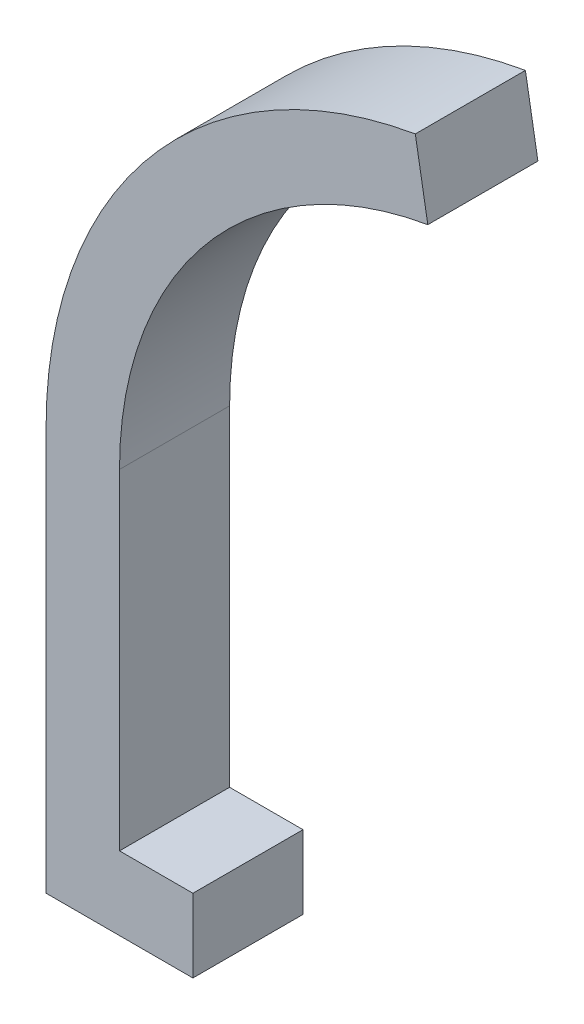
ISO-10303-21;
HEADER;
FILE_DESCRIPTION(('STEP AP214'),'2;1');
FILE_NAME('part.step','',(''),(''),'','','');
FILE_SCHEMA(('AUTOMOTIVE_DESIGN { 1 0 10303 214 1 1 1 1 }'));
ENDSEC;
DATA;
#1=APPLICATION_CONTEXT('core data for automotive mechanical design processes');
#2=APPLICATION_PROTOCOL_DEFINITION('international standard','automotive_design',2000,#1);
#3=PRODUCT_CONTEXT('',#1,'mechanical');
#4=PRODUCT('Part','Part','',(#3));
#5=PRODUCT_RELATED_PRODUCT_CATEGORY('part','',(#4));
#6=PRODUCT_DEFINITION_FORMATION('','',#4);
#7=PRODUCT_DEFINITION_CONTEXT('part definition',#1,'design');
#8=PRODUCT_DEFINITION('design','',#6,#7);
#9=PRODUCT_DEFINITION_SHAPE('','',#8);
#10=(LENGTH_UNIT() NAMED_UNIT(*) SI_UNIT(.MILLI.,.METRE.));
#11=(NAMED_UNIT(*) PLANE_ANGLE_UNIT() SI_UNIT($,.RADIAN.));
#12=(NAMED_UNIT(*) SI_UNIT($,.STERADIAN.) SOLID_ANGLE_UNIT());
#13=UNCERTAINTY_MEASURE_WITH_UNIT(LENGTH_MEASURE(1.E-05),#10,'distance_accuracy_value','');
#14=(GEOMETRIC_REPRESENTATION_CONTEXT(3) GLOBAL_UNCERTAINTY_ASSIGNED_CONTEXT((#13)) GLOBAL_UNIT_ASSIGNED_CONTEXT((#10,
#11,#12)) REPRESENTATION_CONTEXT('',''));
#15=CARTESIAN_POINT('',(0.,0.,0.));
#16=DIRECTION('',(0.,0.,1.));
#17=DIRECTION('',(1.,0.,0.));
#18=AXIS2_PLACEMENT_3D('',#15,#16,#17);
#19=CARTESIAN_POINT('',(-8.76923076923071,70.,30.));
#20=DIRECTION('',(0.,0.,-1.));
#21=DIRECTION('',(-1.,0.,0.));
#22=AXIS2_PLACEMENT_3D('',#19,#20,#21);
#23=CYLINDRICAL_SURFACE('',#22,101.230769230769);
#24=CARTESIAN_POINT('',(-8.76923076923071,70.,0.));
#25=DIRECTION('',(0.,0.,-1.));
#26=DIRECTION('',(-1.,0.,0.));
#27=AXIS2_PLACEMENT_3D('',#24,#25,#26);
#28=CIRCLE('',#27,101.230769230769);
#29=CARTESIAN_POINT('',(-110.,70.,0.));
#30=VERTEX_POINT('',#29);
#31=CARTESIAN_POINT('',(-26.,169.75354244722,0.));
#32=VERTEX_POINT('',#31);
#33=EDGE_CURVE('E132',#30,#32,#28,.T.);
#34=ORIENTED_EDGE('',*,*,#33,.T.);
#35=DIRECTION('',(0.,0.,-1.));
#36=VECTOR('',#35,1.);
#37=CARTESIAN_POINT('',(-26.,169.75354244722,30.));
#38=LINE('',#37,#36);
#39=CARTESIAN_POINT('',(-26.,169.75354244722,30.));
#40=VERTEX_POINT('',#39);
#41=EDGE_CURVE('E40',#40,#32,#38,.T.);
#42=ORIENTED_EDGE('',*,*,#41,.F.);
#43=CARTESIAN_POINT('',(-8.76923076923071,70.,30.));
#44=DIRECTION('',(0.,0.,-1.));
#45=DIRECTION('',(-1.,0.,0.));
#46=AXIS2_PLACEMENT_3D('',#43,#44,#45);
#47=CIRCLE('',#46,101.230769230769);
#48=CARTESIAN_POINT('',(-110.,70.,30.));
#49=VERTEX_POINT('',#48);
#50=EDGE_CURVE('E92',#49,#40,#47,.T.);
#51=ORIENTED_EDGE('',*,*,#50,.F.);
#52=DIRECTION('',(0.,0.,-1.));
#53=VECTOR('',#52,1.);
#54=CARTESIAN_POINT('',(-110.,70.,30.));
#55=LINE('',#54,#53);
#56=EDGE_CURVE('E11',#49,#30,#55,.T.);
#57=ORIENTED_EDGE('',*,*,#56,.T.);
#58=EDGE_LOOP('',(#34,#42,#51,#57));
#59=FACE_BOUND('',#58,.T.);
#60=ADVANCED_FACE('F32',(#59),#23,.F.);
#61=CARTESIAN_POINT('',(-26.,169.75354244722,30.));
#62=DIRECTION('',(-0.985407334205056,-0.170212765957447,0.));
#63=DIRECTION('',(0.170212765957447,-0.985407334205056,0.));
#64=AXIS2_PLACEMENT_3D('',#61,#62,#63);
#65=PLANE('',#64);
#66=DIRECTION('',(-0.170212765957447,0.985407334205056,0.));
#67=VECTOR('',#66,1.);
#68=CARTESIAN_POINT('',(-26.,169.75354244722,0.));
#69=LINE('',#68,#67);
#70=CARTESIAN_POINT('',(-29.404255319149,189.461689131321,0.));
#71=VERTEX_POINT('',#70);
#72=EDGE_CURVE('E134',#32,#71,#69,.T.);
#73=ORIENTED_EDGE('',*,*,#72,.T.);
#74=DIRECTION('',(0.,0.,-1.));
#75=VECTOR('',#74,1.);
#76=CARTESIAN_POINT('',(-29.404255319149,189.461689131321,30.));
#77=LINE('',#76,#75);
#78=CARTESIAN_POINT('',(-29.404255319149,189.461689131321,30.));
#79=VERTEX_POINT('',#78);
#80=EDGE_CURVE('E152',#79,#71,#77,.T.);
#81=ORIENTED_EDGE('',*,*,#80,.F.);
#82=DIRECTION('',(-0.170212765957447,0.985407334205056,0.));
#83=VECTOR('',#82,1.);
#84=CARTESIAN_POINT('',(-26.,169.75354244722,30.));
#85=LINE('',#84,#83);
#86=EDGE_CURVE('E160',#40,#79,#85,.T.);
#87=ORIENTED_EDGE('',*,*,#86,.F.);
#88=ORIENTED_EDGE('',*,*,#41,.T.);
#89=EDGE_LOOP('',(#73,#81,#87,#88));
#90=FACE_BOUND('',#89,.T.);
#91=ADVANCED_FACE('F158',(#90),#65,.F.);
#92=CARTESIAN_POINT('',(-8.76923076923071,70.,30.));
#93=DIRECTION('',(0.,0.,-1.));
#94=DIRECTION('',(-1.,0.,0.));
#95=AXIS2_PLACEMENT_3D('',#92,#93,#94);
#96=CYLINDRICAL_SURFACE('',#95,121.230769230769);
#97=CARTESIAN_POINT('',(-8.76923076923071,70.,0.));
#98=DIRECTION('',(0.,0.,1.));
#99=DIRECTION('',(-1.,0.,0.));
#100=AXIS2_PLACEMENT_3D('',#97,#98,#99);
#101=CIRCLE('',#100,121.230769230769);
#102=CARTESIAN_POINT('',(-130.,70.,0.));
#103=VERTEX_POINT('',#102);
#104=EDGE_CURVE('E136',#71,#103,#101,.T.);
#105=ORIENTED_EDGE('',*,*,#104,.T.);
#106=DIRECTION('',(0.,0.,-1.));
#107=VECTOR('',#106,1.);
#108=CARTESIAN_POINT('',(-130.,70.,30.));
#109=LINE('',#108,#107);
#110=CARTESIAN_POINT('',(-130.,70.,30.));
#111=VERTEX_POINT('',#110);
#112=EDGE_CURVE('E149',#111,#103,#109,.T.);
#113=ORIENTED_EDGE('',*,*,#112,.F.);
#114=CARTESIAN_POINT('',(-8.76923076923071,70.,30.));
#115=DIRECTION('',(0.,0.,1.));
#116=DIRECTION('',(-1.,0.,0.));
#117=AXIS2_PLACEMENT_3D('',#114,#115,#116);
#118=CIRCLE('',#117,121.230769230769);
#119=EDGE_CURVE('E172',#79,#111,#118,.T.);
#120=ORIENTED_EDGE('',*,*,#119,.F.);
#121=ORIENTED_EDGE('',*,*,#80,.T.);
#122=EDGE_LOOP('',(#105,#113,#120,#121));
#123=FACE_BOUND('',#122,.T.);
#124=ADVANCED_FACE('F168',(#123),#96,.T.);
#125=CARTESIAN_POINT('',(-130.,-40.,30.));
#126=DIRECTION('',(1.,0.,0.));
#127=DIRECTION('',(0.,0.,-1.));
#128=AXIS2_PLACEMENT_3D('',#125,#126,#127);
#129=PLANE('',#128);
#130=DIRECTION('',(0.,-1.,0.));
#131=VECTOR('',#130,1.);
#132=CARTESIAN_POINT('',(-130.,-40.,0.));
#133=LINE('',#132,#131);
#134=CARTESIAN_POINT('',(-130.,-40.,0.));
#135=VERTEX_POINT('',#134);
#136=EDGE_CURVE('E139',#103,#135,#133,.T.);
#137=ORIENTED_EDGE('',*,*,#136,.T.);
#138=DIRECTION('',(0.,0.,-1.));
#139=VECTOR('',#138,1.);
#140=CARTESIAN_POINT('',(-130.,-40.,30.));
#141=LINE('',#140,#139);
#142=CARTESIAN_POINT('',(-130.,-40.,30.));
#143=VERTEX_POINT('',#142);
#144=EDGE_CURVE('E121',#143,#135,#141,.T.);
#145=ORIENTED_EDGE('',*,*,#144,.F.);
#146=DIRECTION('',(0.,-1.,0.));
#147=VECTOR('',#146,1.);
#148=CARTESIAN_POINT('',(-130.,0.,30.));
#149=LINE('',#148,#147);
#150=EDGE_CURVE('E112',#111,#143,#149,.T.);
#151=ORIENTED_EDGE('',*,*,#150,.F.);
#152=ORIENTED_EDGE('',*,*,#112,.T.);
#153=EDGE_LOOP('',(#137,#145,#151,#152));
#154=FACE_BOUND('',#153,.T.);
#155=ADVANCED_FACE('F171',(#154),#129,.F.);
#156=CARTESIAN_POINT('',(-90.,-40.,30.));
#157=DIRECTION('',(0.,1.,0.));
#158=DIRECTION('',(0.,0.,1.));
#159=AXIS2_PLACEMENT_3D('',#156,#157,#158);
#160=PLANE('',#159);
#161=DIRECTION('',(1.,0.,0.));
#162=VECTOR('',#161,1.);
#163=CARTESIAN_POINT('',(-90.,-40.,0.));
#164=LINE('',#163,#162);
#165=CARTESIAN_POINT('',(-90.,-40.,0.));
#166=VERTEX_POINT('',#165);
#167=EDGE_CURVE('E120',#135,#166,#164,.T.);
#168=ORIENTED_EDGE('',*,*,#167,.T.);
#169=DIRECTION('',(0.,0.,-1.));
#170=VECTOR('',#169,1.);
#171=CARTESIAN_POINT('',(-90.,-40.,30.));
#172=LINE('',#171,#170);
#173=CARTESIAN_POINT('',(-90.,-40.,30.));
#174=VERTEX_POINT('',#173);
#175=EDGE_CURVE('E117',#174,#166,#172,.T.);
#176=ORIENTED_EDGE('',*,*,#175,.F.);
#177=DIRECTION('',(1.,0.,0.));
#178=VECTOR('',#177,1.);
#179=CARTESIAN_POINT('',(-90.,-40.,30.));
#180=LINE('',#179,#178);
#181=EDGE_CURVE('E106',#143,#174,#180,.T.);
#182=ORIENTED_EDGE('',*,*,#181,.F.);
#183=ORIENTED_EDGE('',*,*,#144,.T.);
#184=EDGE_LOOP('',(#168,#176,#182,#183));
#185=FACE_BOUND('',#184,.T.);
#186=ADVANCED_FACE('F118',(#185),#160,.F.);
#187=CARTESIAN_POINT('',(-90.,-20.,30.));
#188=DIRECTION('',(-1.,0.,0.));
#189=DIRECTION('',(0.,0.,1.));
#190=AXIS2_PLACEMENT_3D('',#187,#188,#189);
#191=PLANE('',#190);
#192=DIRECTION('',(0.,1.,0.));
#193=VECTOR('',#192,1.);
#194=CARTESIAN_POINT('',(-90.,-20.,0.));
#195=LINE('',#194,#193);
#196=CARTESIAN_POINT('',(-90.,-20.,0.));
#197=VERTEX_POINT('',#196);
#198=EDGE_CURVE('E78',#166,#197,#195,.T.);
#199=ORIENTED_EDGE('',*,*,#198,.T.);
#200=DIRECTION('',(0.,0.,-1.));
#201=VECTOR('',#200,1.);
#202=CARTESIAN_POINT('',(-90.,-20.,30.));
#203=LINE('',#202,#201);
#204=CARTESIAN_POINT('',(-90.,-20.,30.));
#205=VERTEX_POINT('',#204);
#206=EDGE_CURVE('E122',#205,#197,#203,.T.);
#207=ORIENTED_EDGE('',*,*,#206,.F.);
#208=DIRECTION('',(0.,1.,0.));
#209=VECTOR('',#208,1.);
#210=CARTESIAN_POINT('',(-90.,-20.,30.));
#211=LINE('',#210,#209);
#212=EDGE_CURVE('E110',#174,#205,#211,.T.);
#213=ORIENTED_EDGE('',*,*,#212,.F.);
#214=ORIENTED_EDGE('',*,*,#175,.T.);
#215=EDGE_LOOP('',(#199,#207,#213,#214));
#216=FACE_BOUND('',#215,.T.);
#217=ADVANCED_FACE('F124',(#216),#191,.F.);
#218=CARTESIAN_POINT('',(-110.,-20.,30.));
#219=DIRECTION('',(0.,-1.,0.));
#220=DIRECTION('',(0.,0.,-1.));
#221=AXIS2_PLACEMENT_3D('',#218,#219,#220);
#222=PLANE('',#221);
#223=DIRECTION('',(-1.,0.,0.));
#224=VECTOR('',#223,1.);
#225=CARTESIAN_POINT('',(-110.,-20.,0.));
#226=LINE('',#225,#224);
#227=CARTESIAN_POINT('',(-110.,-20.,0.));
#228=VERTEX_POINT('',#227);
#229=EDGE_CURVE('E85',#197,#228,#226,.T.);
#230=ORIENTED_EDGE('',*,*,#229,.T.);
#231=DIRECTION('',(0.,0.,-1.));
#232=VECTOR('',#231,1.);
#233=CARTESIAN_POINT('',(-110.,-20.,30.));
#234=LINE('',#233,#232);
#235=CARTESIAN_POINT('',(-110.,-20.,30.));
#236=VERTEX_POINT('',#235);
#237=EDGE_CURVE('E128',#236,#228,#234,.T.);
#238=ORIENTED_EDGE('',*,*,#237,.F.);
#239=DIRECTION('',(-1.,0.,0.));
#240=VECTOR('',#239,1.);
#241=CARTESIAN_POINT('',(-110.,-20.,30.));
#242=LINE('',#241,#240);
#243=EDGE_CURVE('E126',#205,#236,#242,.T.);
#244=ORIENTED_EDGE('',*,*,#243,.F.);
#245=ORIENTED_EDGE('',*,*,#206,.T.);
#246=EDGE_LOOP('',(#230,#238,#244,#245));
#247=FACE_BOUND('',#246,.T.);
#248=ADVANCED_FACE('F193',(#247),#222,.F.);
#249=CARTESIAN_POINT('',(-110.,-20.,30.));
#250=DIRECTION('',(-1.,0.,0.));
#251=DIRECTION('',(0.,-1.,0.));
#252=AXIS2_PLACEMENT_3D('',#249,#250,#251);
#253=PLANE('',#252);
#254=DIRECTION('',(0.,1.,0.));
#255=VECTOR('',#254,1.);
#256=CARTESIAN_POINT('',(-110.,-20.,0.));
#257=LINE('',#256,#255);
#258=EDGE_CURVE('E144',#228,#30,#257,.T.);
#259=ORIENTED_EDGE('',*,*,#258,.T.);
#260=ORIENTED_EDGE('',*,*,#56,.F.);
#261=DIRECTION('',(0.,1.,0.));
#262=VECTOR('',#261,1.);
#263=CARTESIAN_POINT('',(-110.,0.,30.));
#264=LINE('',#263,#262);
#265=EDGE_CURVE('E48',#236,#49,#264,.T.);
#266=ORIENTED_EDGE('',*,*,#265,.F.);
#267=ORIENTED_EDGE('',*,*,#237,.T.);
#268=EDGE_LOOP('',(#259,#260,#266,#267));
#269=FACE_BOUND('',#268,.T.);
#270=ADVANCED_FACE('F177',(#269),#253,.F.);
#271=CARTESIAN_POINT('',(-8.76923076923071,70.,30.));
#272=DIRECTION('',(0.,0.,-1.));
#273=DIRECTION('',(-1.,0.,0.));
#274=AXIS2_PLACEMENT_3D('',#271,#272,#273);
#275=PLANE('',#274);
#276=ORIENTED_EDGE('',*,*,#265,.T.);
#277=ORIENTED_EDGE('',*,*,#50,.T.);
#278=ORIENTED_EDGE('',*,*,#86,.T.);
#279=ORIENTED_EDGE('',*,*,#119,.T.);
#280=ORIENTED_EDGE('',*,*,#150,.T.);
#281=ORIENTED_EDGE('',*,*,#181,.T.);
#282=ORIENTED_EDGE('',*,*,#212,.T.);
#283=ORIENTED_EDGE('',*,*,#243,.T.);
#284=EDGE_LOOP('',(#276,#277,#278,#279,#280,#281,#282,#283));
#285=FACE_BOUND('',#284,.T.);
#286=ADVANCED_FACE('F108',(#285),#275,.F.);
#287=CARTESIAN_POINT('',(-8.76923076923071,70.,0.));
#288=DIRECTION('',(0.,0.,-1.));
#289=DIRECTION('',(-1.,0.,0.));
#290=AXIS2_PLACEMENT_3D('',#287,#288,#289);
#291=PLANE('',#290);
#292=ORIENTED_EDGE('',*,*,#33,.F.);
#293=ORIENTED_EDGE('',*,*,#258,.F.);
#294=ORIENTED_EDGE('',*,*,#229,.F.);
#295=ORIENTED_EDGE('',*,*,#198,.F.);
#296=ORIENTED_EDGE('',*,*,#167,.F.);
#297=ORIENTED_EDGE('',*,*,#136,.F.);
#298=ORIENTED_EDGE('',*,*,#104,.F.);
#299=ORIENTED_EDGE('',*,*,#72,.F.);
#300=EDGE_LOOP('',(#292,#293,#294,#295,#296,#297,#298,#299));
#301=FACE_BOUND('',#300,.T.);
#302=ADVANCED_FACE('F164',(#301),#291,.T.);
#303=CLOSED_SHELL('',(#60,#91,#124,#155,#186,#217,#248,#270,#286,#302));
#304=MANIFOLD_SOLID_BREP('B2',#303);
#305=ADVANCED_BREP_SHAPE_REPRESENTATION('',(#18,#304),#14);
#306=SHAPE_DEFINITION_REPRESENTATION(#9,#305);
ENDSEC;
END-ISO-10303-21;
